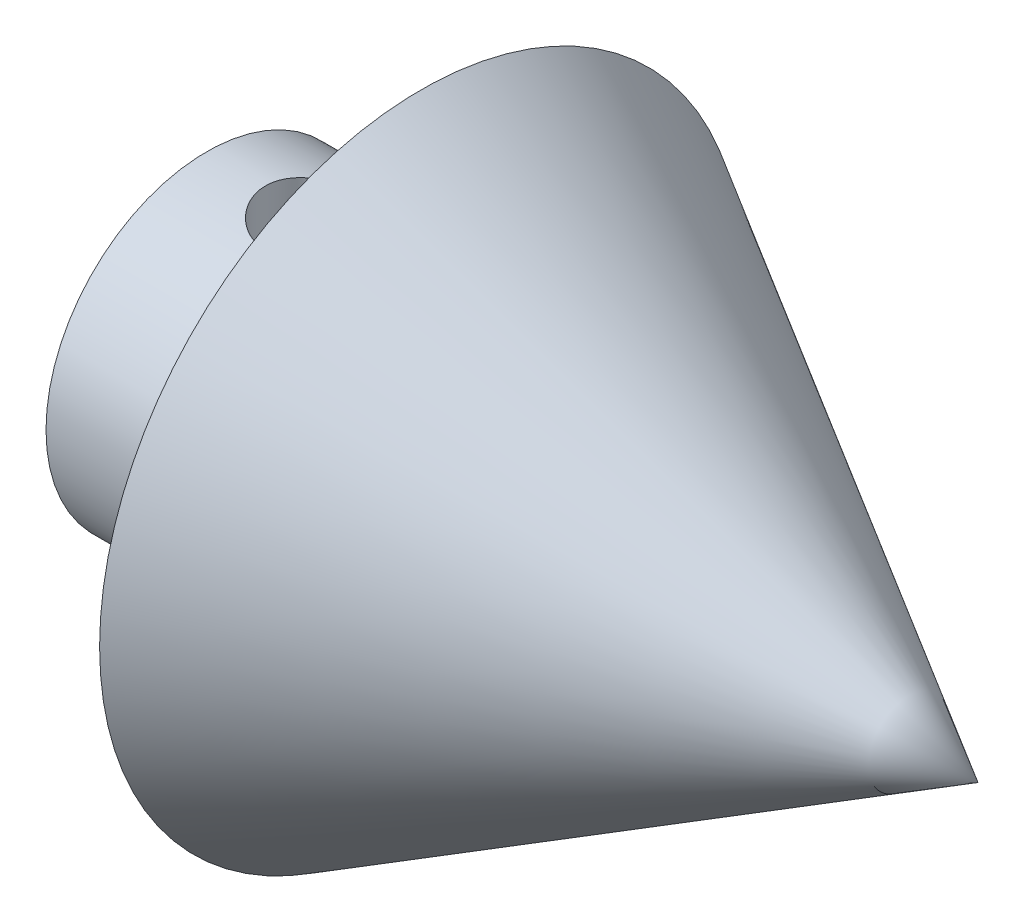
ISO-10303-21;
HEADER;
FILE_DESCRIPTION(('STEP AP214'),'2;1');
FILE_NAME('part.step','',(''),(''),'','','');
FILE_SCHEMA(('AUTOMOTIVE_DESIGN { 1 0 10303 214 1 1 1 1 }'));
ENDSEC;
DATA;
#1=APPLICATION_CONTEXT('core data for automotive mechanical design processes');
#2=APPLICATION_PROTOCOL_DEFINITION('international standard','automotive_design',2000,#1);
#3=PRODUCT_CONTEXT('',#1,'mechanical');
#4=PRODUCT('Part','Part','',(#3));
#5=PRODUCT_RELATED_PRODUCT_CATEGORY('part','',(#4));
#6=PRODUCT_DEFINITION_FORMATION('','',#4);
#7=PRODUCT_DEFINITION_CONTEXT('part definition',#1,'design');
#8=PRODUCT_DEFINITION('design','',#6,#7);
#9=PRODUCT_DEFINITION_SHAPE('','',#8);
#10=(LENGTH_UNIT() NAMED_UNIT(*) SI_UNIT(.MILLI.,.METRE.));
#11=(NAMED_UNIT(*) PLANE_ANGLE_UNIT() SI_UNIT($,.RADIAN.));
#12=(NAMED_UNIT(*) SI_UNIT($,.STERADIAN.) SOLID_ANGLE_UNIT());
#13=UNCERTAINTY_MEASURE_WITH_UNIT(LENGTH_MEASURE(1.E-05),#10,'distance_accuracy_value','');
#14=(GEOMETRIC_REPRESENTATION_CONTEXT(3) GLOBAL_UNCERTAINTY_ASSIGNED_CONTEXT((#13)) GLOBAL_UNIT_ASSIGNED_CONTEXT((#10,
#11,#12)) REPRESENTATION_CONTEXT('',''));
#15=CARTESIAN_POINT('',(0.,0.,0.));
#16=DIRECTION('',(0.,0.,1.));
#17=DIRECTION('',(1.,0.,0.));
#18=AXIS2_PLACEMENT_3D('',#15,#16,#17);
#19=CARTESIAN_POINT('',(10.,0.,0.));
#20=DIRECTION('',(-1.,0.,0.));
#21=DIRECTION('',(0.,0.,-1.));
#22=AXIS2_PLACEMENT_3D('',#19,#20,#21);
#23=CONICAL_SURFACE('',#22,15.,0.5235987755983);
#24=CARTESIAN_POINT('',(35.9807621135331,0.,0.));
#25=VERTEX_POINT('',#24);
#26=VERTEX_LOOP('',#25);
#27=FACE_BOUND('',#26,.T.);
#28=CARTESIAN_POINT('',(10.,0.,0.));
#29=DIRECTION('',(1.,0.,0.));
#30=DIRECTION('',(0.,0.,-1.));
#31=AXIS2_PLACEMENT_3D('',#28,#29,#30);
#32=CIRCLE('',#31,15.);
#33=CARTESIAN_POINT('',(10.,0.,-15.));
#34=VERTEX_POINT('',#33);
#35=EDGE_CURVE('E12',#34,#34,#32,.T.);
#36=ORIENTED_EDGE('',*,*,#35,.T.);
#37=EDGE_LOOP('',(#36));
#38=FACE_BOUND('',#37,.T.);
#39=ADVANCED_FACE('F41',(#27,#38),#23,.T.);
#40=CARTESIAN_POINT('',(10.,0.,0.));
#41=DIRECTION('',(1.,0.,0.));
#42=DIRECTION('',(0.,0.,-1.));
#43=AXIS2_PLACEMENT_3D('',#40,#41,#42);
#44=PLANE('',#43);
#45=CARTESIAN_POINT('',(10.,0.,0.));
#46=DIRECTION('',(1.,0.,0.));
#47=DIRECTION('',(0.,0.,-1.));
#48=AXIS2_PLACEMENT_3D('',#45,#46,#47);
#49=CIRCLE('',#48,4.05);
#50=CARTESIAN_POINT('',(10.,0.,-4.05));
#51=VERTEX_POINT('',#50);
#52=EDGE_CURVE('E44',#51,#51,#49,.T.);
#53=ORIENTED_EDGE('',*,*,#52,.T.);
#54=EDGE_LOOP('',(#53));
#55=FACE_BOUND('',#54,.T.);
#56=ORIENTED_EDGE('',*,*,#35,.F.);
#57=EDGE_LOOP('',(#56));
#58=FACE_BOUND('',#57,.T.);
#59=ADVANCED_FACE('F52',(#55,#58),#44,.F.);
#60=CARTESIAN_POINT('',(15.,0.,0.));
#61=DIRECTION('',(-1.,0.,0.));
#62=DIRECTION('',(0.,0.,1.));
#63=AXIS2_PLACEMENT_3D('',#60,#61,#62);
#64=CYLINDRICAL_SURFACE('',#63,4.05);
#65=CARTESIAN_POINT('',(15.,0.,0.));
#66=DIRECTION('',(-1.,0.,0.));
#67=DIRECTION('',(0.,0.,1.));
#68=AXIS2_PLACEMENT_3D('',#65,#66,#67);
#69=CIRCLE('',#68,4.05);
#70=CARTESIAN_POINT('',(15.,0.,4.05));
#71=VERTEX_POINT('',#70);
#72=EDGE_CURVE('E72',#71,#71,#69,.T.);
#73=ORIENTED_EDGE('',*,*,#72,.F.);
#74=EDGE_LOOP('',(#73));
#75=FACE_BOUND('',#74,.T.);
#76=ORIENTED_EDGE('',*,*,#52,.F.);
#77=EDGE_LOOP('',(#76));
#78=FACE_BOUND('',#77,.T.);
#79=ADVANCED_FACE('F56',(#75,#78),#64,.F.);
#80=CARTESIAN_POINT('',(15.,0.,0.));
#81=DIRECTION('',(-1.,0.,0.));
#82=DIRECTION('',(0.,0.,1.));
#83=AXIS2_PLACEMENT_3D('',#80,#81,#82);
#84=PLANE('',#83);
#85=ORIENTED_EDGE('',*,*,#72,.T.);
#86=EDGE_LOOP('',(#85));
#87=FACE_BOUND('',#86,.T.);
#88=ADVANCED_FACE('F61',(#87),#84,.T.);
#89=CLOSED_SHELL('',(#39,#59,#79,#88));
#90=MANIFOLD_SOLID_BREP('B2',#89);
#91=CARTESIAN_POINT('',(10.,0.,0.));
#92=DIRECTION('',(-1.,0.,0.));
#93=DIRECTION('',(0.,0.,1.));
#94=AXIS2_PLACEMENT_3D('',#91,#92,#93);
#95=CYLINDRICAL_SURFACE('',#94,7.5);
#96=CARTESIAN_POINT('',(4.99997596608746,7.15054229190611,2.26268533642265));
#97=CARTESIAN_POINT('',(4.87679337057992,7.15054357941597,2.26268379037705));
#98=CARTESIAN_POINT('',(4.75359544966686,7.15377912567736,2.25253215308062));
#99=CARTESIAN_POINT('',(4.51080102191502,7.16632195741708,2.21229762657343));
#100=CARTESIAN_POINT('',(4.39120573764294,7.17563128030004,2.18220804927137));
#101=CARTESIAN_POINT('',(4.15916661725308,7.19918001078882,2.10320912978589));
#102=CARTESIAN_POINT('',(4.0467112628587,7.21341122611226,2.05433104530812));
#103=CARTESIAN_POINT('',(3.83157418277967,7.24519755220514,1.93924281705836));
#104=CARTESIAN_POINT('',(3.72889391740794,7.26275315844224,1.87303008916539));
#105=CARTESIAN_POINT('',(3.53297816985963,7.29984344897836,1.72290983910972));
#106=CARTESIAN_POINT('',(3.44009708467844,7.3194203934373,1.63855014391216));
#107=CARTESIAN_POINT('',(3.26957251468485,7.35800717724413,1.45549573569578));
#108=CARTESIAN_POINT('',(3.19193098493638,7.3770169435645,1.35679918624189));
#109=CARTESIAN_POINT('',(3.0525510815369,7.4128192374948,1.14534984413225));
#110=CARTESIAN_POINT('',(2.99117397521269,7.42955791078668,1.03234900233786));
#111=CARTESIAN_POINT('',(2.88843702559571,7.45846843644308,0.797042016060031));
#112=CARTESIAN_POINT('',(2.84707287366626,7.47064127167081,0.674737881072196));
#113=CARTESIAN_POINT('',(2.78670860106753,7.48876981656921,0.428000959635591));
#114=CARTESIAN_POINT('',(2.76710357518289,7.49489313844391,0.303728694976725));
#115=CARTESIAN_POINT('',(2.74890143326738,7.50085211421138,0.0535167710069383));
#116=CARTESIAN_POINT('',(2.75029991273856,7.50068908635927,-0.0724225331864531));
#117=CARTESIAN_POINT('',(2.77365888009148,7.49422565060817,-0.318149834549734));
#118=CARTESIAN_POINT('',(2.79496431665145,7.48812050637206,-0.438006109529969));
#119=CARTESIAN_POINT('',(2.85646248674655,7.47072539564096,-0.672367378326634));
#120=CARTESIAN_POINT('',(2.89665641552489,7.45943510103633,-0.786872032994154));
#121=CARTESIAN_POINT('',(2.99523467955034,7.43269145067441,-1.00883638469506));
#122=CARTESIAN_POINT('',(3.05382519320071,7.41719119193473,-1.11619862729616));
#123=CARTESIAN_POINT('',(3.18737039533648,7.38368700026265,-1.31978264294365));
#124=CARTESIAN_POINT('',(3.26232896035293,7.36568247459895,-1.41600176863212));
#125=CARTESIAN_POINT('',(3.4298804391709,7.32829370867438,-1.59847613945729));
#126=CARTESIAN_POINT('',(3.52304092616726,7.30888303648189,-1.6842055085725));
#127=CARTESIAN_POINT('',(3.72260033447811,7.27148834343886,-1.83897067609428));
#128=CARTESIAN_POINT('',(3.82900056471838,7.25350446393415,-1.90800482196556));
#129=CARTESIAN_POINT('',(4.05340176115197,7.22089186084338,-2.02796414578094));
#130=CARTESIAN_POINT('',(4.17150386363441,7.20629683974785,-2.07870997891411));
#131=CARTESIAN_POINT('',(4.41511538994261,7.18252532669782,-2.15942601545848));
#132=CARTESIAN_POINT('',(4.54062238816178,7.17334707110536,-2.18940298153284));
#133=CARTESIAN_POINT('',(4.79047638508218,7.16184155109709,-2.22674551161446));
#134=CARTESIAN_POINT('',(4.91469278524462,7.15927207907318,-2.23491090818815));
#135=CARTESIAN_POINT('',(5.16272356848334,7.16060684068957,-2.23063135708042));
#136=CARTESIAN_POINT('',(5.28653800528867,7.16451017015378,-2.21818928802573));
#137=CARTESIAN_POINT('',(5.52691837024136,7.17811072703266,-2.1737609605993));
#138=CARTESIAN_POINT('',(5.6435889917182,7.18765518111397,-2.14228955606984));
#139=CARTESIAN_POINT('',(5.86998930147701,7.21129901931966,-2.06129438487067));
#140=CARTESIAN_POINT('',(5.97971791637162,7.22539910579693,-2.01176783444409));
#141=CARTESIAN_POINT('',(6.19237116029451,7.25702686699597,-1.89455265583966));
#142=CARTESIAN_POINT('',(6.29503464936533,7.27463626997283,-1.826412878353));
#143=CARTESIAN_POINT('',(6.48776833056485,7.31111006293411,-1.67444471772035));
#144=CARTESIAN_POINT('',(6.5778355051521,7.32997475203985,-1.59061258656261));
#145=CARTESIAN_POINT('',(6.74631470473028,7.36767887599484,-1.40588348120109));
#146=CARTESIAN_POINT('',(6.82416005669948,7.3864906044396,-1.3044627420674));
#147=CARTESIAN_POINT('',(6.96174688969916,7.42123382893236,-1.08955002088473));
#148=CARTESIAN_POINT('',(7.02148927104653,7.43716546820022,-0.976058639525608));
#149=CARTESIAN_POINT('',(7.12059797047447,7.46423645571167,-0.740980016307052));
#150=CARTESIAN_POINT('',(7.16011655699601,7.47541150640662,-0.619461292916118));
#151=CARTESIAN_POINT('',(7.21804609458142,7.49184466416593,-0.371115680143111));
#152=CARTESIAN_POINT('',(7.23646307248382,7.49710446068038,-0.244290317124202));
#153=CARTESIAN_POINT('',(7.25120896576398,7.50100074956921,0.00582989937588605));
#154=CARTESIAN_POINT('',(7.24835975550943,7.49988407655861,0.129073057368888));
#155=CARTESIAN_POINT('',(7.22261839563886,7.49170308639229,0.373235947269854));
#156=CARTESIAN_POINT('',(7.19972737880506,7.48463910538503,0.49415581009796));
#157=CARTESIAN_POINT('',(7.13506045683857,7.46540896299629,0.728981152795254));
#158=CARTESIAN_POINT('',(7.09348925827731,7.453298208438,0.842947846439346));
#159=CARTESIAN_POINT('',(6.99282511961403,7.42520569547836,1.06233995024026));
#160=CARTESIAN_POINT('',(6.9337293031484,7.40922330169316,1.16776395464252));
#161=CARTESIAN_POINT('',(6.79750393320205,7.37441629557474,1.37074177700638));
#162=CARTESIAN_POINT('',(6.71985847627231,7.35551718275013,1.46793647347106));
#163=CARTESIAN_POINT('',(6.54966740551019,7.3172383626256,1.64819008295867));
#164=CARTESIAN_POINT('',(6.45711750370667,7.29785851838191,1.73124491378951));
#165=CARTESIAN_POINT('',(6.25644220196665,7.26012045374531,1.88334417729523));
#166=CARTESIAN_POINT('',(6.14793552080273,7.24180974073265,1.95189862573339));
#167=CARTESIAN_POINT('',(5.92040510521046,7.20902352037099,2.06972021261822));
#168=CARTESIAN_POINT('',(5.80138647548075,7.19454616501566,2.11899665020652));
#169=CARTESIAN_POINT('',(5.56950200313366,7.1724926512954,2.19240854752189));
#170=CARTESIAN_POINT('',(5.45736728477538,7.16433860623185,2.2186899329654));
#171=CARTESIAN_POINT('',(5.23015109751146,7.15336335711365,2.25382731112916));
#172=CARTESIAN_POINT('',(5.11507022125192,7.15054108893594,2.26268678095275));
#173=CARTESIAN_POINT('',(4.99997596608746,7.15054229190611,2.26268533642265));
#174=B_SPLINE_CURVE_WITH_KNOTS('',3,(#96,#97,#98,#99,#100,#101,#102,#103,#104,#105,#106,#107,
#108,#109,#110,#111,#112,#113,#114,#115,#116,#117,#118,#119,#120,#121,#122,#123,#124,#125,#126,
#127,#128,#129,#130,#131,#132,#133,#134,#135,#136,#137,#138,#139,#140,#141,#142,#143,#144,#145,
#146,#147,#148,#149,#150,#151,#152,#153,#154,#155,#156,#157,#158,#159,#160,#161,#162,#163,#164,
#165,#166,#167,#168,#169,#170,#171,#172,#173),.UNSPECIFIED.,.T.,.F.,(4,2,2,2,2,2,2,2,2,2,2,2,2,
2,2,2,2,2,2,2,2,2,2,2,2,2,2,2,2,2,2,2,2,2,2,2,2,2,4),(0.,0.369123231396214,0.738370346227436,
1.10700579931818,1.47569623718931,1.85493814886536,2.23422868126905,2.62134678070632,
3.00838149943743,3.38436389732316,3.7602674516756,4.12422154598411,4.48819867401306,
4.85641013182744,5.22470888984949,5.60717964069045,5.98968823397006,6.37585191227168,
6.76188979055798,7.13356380691976,7.50518590906033,7.86717723590781,8.22922439848928,
8.60097390147329,8.97281230784723,9.35865414884421,9.7444767975788,10.1273501267049,
10.5101140759526,10.8781641570206,11.2461934368859,11.6102844715312,11.9744352985438,
12.3502220396453,12.7261170874208,13.1131883913157,13.5000727525803,13.8450276936651,
14.1899137809115),.UNSPECIFIED.);
#175=CARTESIAN_POINT('',(4.99997596608746,7.15054229190611,2.26268533642265));
#176=VERTEX_POINT('',#175);
#177=EDGE_CURVE('E117',#176,#176,#174,.T.);
#178=ORIENTED_EDGE('',*,*,#177,.T.);
#179=EDGE_LOOP('',(#178));
#180=FACE_BOUND('',#179,.T.);
#181=CARTESIAN_POINT('',(10.,0.,0.));
#182=DIRECTION('',(1.,0.,0.));
#183=DIRECTION('',(0.,0.,-1.));
#184=AXIS2_PLACEMENT_3D('',#181,#182,#183);
#185=CIRCLE('',#184,7.5);
#186=CARTESIAN_POINT('',(10.,0.,-7.5));
#187=VERTEX_POINT('',#186);
#188=EDGE_CURVE('E40',#187,#187,#185,.T.);
#189=ORIENTED_EDGE('',*,*,#188,.F.);
#190=EDGE_LOOP('',(#189));
#191=FACE_BOUND('',#190,.T.);
#192=CARTESIAN_POINT('',(0.,0.,0.));
#193=DIRECTION('',(1.,0.,0.));
#194=DIRECTION('',(0.,0.,-1.));
#195=AXIS2_PLACEMENT_3D('',#192,#193,#194);
#196=CIRCLE('',#195,7.5);
#197=CARTESIAN_POINT('',(0.,0.,-7.5));
#198=VERTEX_POINT('',#197);
#199=EDGE_CURVE('E103',#198,#198,#196,.T.);
#200=ORIENTED_EDGE('',*,*,#199,.T.);
#201=EDGE_LOOP('',(#200));
#202=FACE_BOUND('',#201,.T.);
#203=ADVANCED_FACE('F99',(#180,#191,#202),#95,.T.);
#204=CARTESIAN_POINT('',(10.,0.,0.));
#205=DIRECTION('',(1.,0.,0.));
#206=DIRECTION('',(0.,0.,-1.));
#207=AXIS2_PLACEMENT_3D('',#204,#205,#206);
#208=PLANE('',#207);
#209=CARTESIAN_POINT('',(10.,0.,0.));
#210=DIRECTION('',(1.,0.,0.));
#211=DIRECTION('',(0.,0.,-1.));
#212=AXIS2_PLACEMENT_3D('',#209,#210,#211);
#213=CIRCLE('',#212,4.05);
#214=CARTESIAN_POINT('',(10.,0.,-4.05));
#215=VERTEX_POINT('',#214);
#216=EDGE_CURVE('E110',#215,#215,#213,.T.);
#217=ORIENTED_EDGE('',*,*,#216,.F.);
#218=EDGE_LOOP('',(#217));
#219=FACE_BOUND('',#218,.T.);
#220=ORIENTED_EDGE('',*,*,#188,.T.);
#221=EDGE_LOOP('',(#220));
#222=FACE_BOUND('',#221,.T.);
#223=ADVANCED_FACE('F139',(#219,#222),#208,.T.);
#224=CARTESIAN_POINT('',(0.,0.,0.));
#225=DIRECTION('',(1.,0.,0.));
#226=DIRECTION('',(0.,0.,-1.));
#227=AXIS2_PLACEMENT_3D('',#224,#225,#226);
#228=PLANE('',#227);
#229=CARTESIAN_POINT('',(0.,0.,0.));
#230=DIRECTION('',(-1.,0.,0.));
#231=DIRECTION('',(0.,0.,1.));
#232=AXIS2_PLACEMENT_3D('',#229,#230,#231);
#233=CIRCLE('',#232,4.05);
#234=CARTESIAN_POINT('',(0.,0.,4.05));
#235=VERTEX_POINT('',#234);
#236=EDGE_CURVE('E114',#235,#235,#233,.T.);
#237=ORIENTED_EDGE('',*,*,#236,.F.);
#238=EDGE_LOOP('',(#237));
#239=FACE_BOUND('',#238,.T.);
#240=ORIENTED_EDGE('',*,*,#199,.F.);
#241=EDGE_LOOP('',(#240));
#242=FACE_BOUND('',#241,.T.);
#243=ADVANCED_FACE('F137',(#239,#242),#228,.F.);
#244=CARTESIAN_POINT('',(15.,0.,0.));
#245=DIRECTION('',(-1.,0.,0.));
#246=DIRECTION('',(0.,0.,1.));
#247=AXIS2_PLACEMENT_3D('',#244,#245,#246);
#248=CYLINDRICAL_SURFACE('',#247,4.05);
#249=CARTESIAN_POINT('',(4.99997596608746,3.36424011223727,2.2548588574928));
#250=CARTESIAN_POINT('',(5.11497084211201,3.36425389212509,2.25484869559021));
#251=CARTESIAN_POINT('',(5.23006670093449,3.37024068058095,2.245984675332));
#252=CARTESIAN_POINT('',(5.45654963482114,3.39324792214886,2.21105714786235));
#253=CARTESIAN_POINT('',(5.56793028003154,3.41028655645953,2.18496529817784));
#254=CARTESIAN_POINT('',(5.78325279183354,3.45277892656039,2.11716585432869));
#255=CARTESIAN_POINT('',(5.88723694271725,3.47817919862475,2.07555725427743));
#256=CARTESIAN_POINT('',(6.08669774873632,3.53445285557669,1.97820540144739));
#257=CARTESIAN_POINT('',(6.18217251846732,3.5653274488896,1.92245902666348));
#258=CARTESIAN_POINT('',(6.3727320989549,3.63294480437054,1.79169321094266));
#259=CARTESIAN_POINT('',(6.46676221536023,3.66996439903257,1.71527942247952));
#260=CARTESIAN_POINT('',(6.64150870124206,3.74350976909221,1.54821575527799));
#261=CARTESIAN_POINT('',(6.72221693448122,3.78003523029324,1.45755724216667));
#262=CARTESIAN_POINT('',(6.87501710984717,3.852318338207,1.2548693668922));
#263=CARTESIAN_POINT('',(6.94572782096121,3.88772619692113,1.14166190664754));
#264=CARTESIAN_POINT('',(7.06659596931252,3.95006149994491,0.90261891777954));
#265=CARTESIAN_POINT('',(7.11676935589879,3.97699552128659,0.776793283382065));
#266=CARTESIAN_POINT('',(7.19067280273627,4.01734072668173,0.527319994504828));
#267=CARTESIAN_POINT('',(7.21627733717308,4.03170140770514,0.404384884013285));
#268=CARTESIAN_POINT('',(7.24657653453463,4.04894584849844,0.155204239708181));
#269=CARTESIAN_POINT('',(7.25128740822192,4.05183850577781,0.0289613488319389));
#270=CARTESIAN_POINT('',(7.24018479358811,4.04617566324327,-0.208785918260737));
#271=CARTESIAN_POINT('',(7.22650536663994,4.03880749778107,-0.320427040653848));
#272=CARTESIAN_POINT('',(7.18295399750104,4.01541167770484,-0.539545908995961));
#273=CARTESIAN_POINT('',(7.15308080757424,3.99938335582254,-0.647023333446526));
#274=CARTESIAN_POINT('',(7.07801513363696,3.95989349912195,-0.856277512983315));
#275=CARTESIAN_POINT('',(7.03266723097642,3.93635671660513,-0.957983718360281));
#276=CARTESIAN_POINT('',(6.92827000033837,3.88385180665874,-1.15254670368684));
#277=CARTESIAN_POINT('',(6.86921636101909,3.85488197073357,-1.24540068604576));
#278=CARTESIAN_POINT('',(6.7317550861205,3.79036987643772,-1.43045921507305));
#279=CARTESIAN_POINT('',(6.65193875089875,3.75445538601598,-1.52148741696997));
#280=CARTESIAN_POINT('',(6.47889440787034,3.68188158961902,-1.68957042041211));
#281=CARTESIAN_POINT('',(6.38565225709279,3.64522153367085,-1.76661029045801));
#282=CARTESIAN_POINT('',(6.17829210733914,3.57154130084337,-1.91148465453799));
#283=CARTESIAN_POINT('',(6.06304871524711,3.53478848307242,-1.97785621141311));
#284=CARTESIAN_POINT('',(5.82056870945581,3.46977478513629,-2.08983272798336));
#285=CARTESIAN_POINT('',(5.6933461979811,3.44150407976974,-2.13546174648875));
#286=CARTESIAN_POINT('',(5.50173829353656,3.41005258843711,-2.18503306730166));
#287=CARTESIAN_POINT('',(5.44048640028464,3.40156461212721,-2.19818408187653));
#288=CARTESIAN_POINT('',(5.31676061161962,3.38779339488815,-2.21935118702792));
#289=CARTESIAN_POINT('',(5.25428745709044,3.38250826962292,-2.2273702970181));
#290=CARTESIAN_POINT('',(5.12873779295727,3.37540511794709,-2.23812034172942));
#291=CARTESIAN_POINT('',(5.06566178308493,3.37358443436167,-2.24085532931795));
#292=CARTESIAN_POINT('',(4.93952141452079,3.37348386937882,-2.24100469869978));
#293=CARTESIAN_POINT('',(4.8764570553212,3.3752035834607,-2.23841968834831));
#294=CARTESIAN_POINT('',(4.70701232902387,3.38454427870411,-2.2242983656997));
#295=CARTESIAN_POINT('',(4.60117874098137,3.39545087689594,-2.20776678069978));
#296=CARTESIAN_POINT('',(4.39416338966706,3.42586266005475,-2.160262707839));
#297=CARTESIAN_POINT('',(4.29298376681002,3.4453717586015,-2.12928364694343));
#298=CARTESIAN_POINT('',(4.09315999069943,3.49164501022254,-2.05255816121551));
#299=CARTESIAN_POINT('',(3.99479352418095,3.51867572293926,-2.00625424714805));
#300=CARTESIAN_POINT('',(3.80663288835036,3.57681929570613,-1.90065635325679));
#301=CARTESIAN_POINT('',(3.71684293988754,3.607934148024,-1.84135602418805));
#302=CARTESIAN_POINT('',(3.53313060644629,3.67676427253866,-1.70029667982063));
#303=CARTESIAN_POINT('',(3.44089364833019,3.7147324528652,-1.61645583906648));
#304=CARTESIAN_POINT('',(3.27109634341315,3.78882071733586,-1.43423094403103));
#305=CARTESIAN_POINT('',(3.19354502231182,3.82493965506289,-1.33583801185242));
#306=CARTESIAN_POINT('',(3.05144951976347,3.89361509042534,-1.12057100750824));
#307=CARTESIAN_POINT('',(2.98782316150646,3.92587762656213,-1.00298983074137));
#308=CARTESIAN_POINT('',(2.88191946703885,3.98071309947987,-0.756505328532974));
#309=CARTESIAN_POINT('',(2.83961962912116,4.00329624524109,-0.627614105721027));
#310=CARTESIAN_POINT('',(2.78189434722203,4.03424853545822,-0.376406942990132));
#311=CARTESIAN_POINT('',(2.76415612736117,4.04383870046387,-0.254773998192213));
#312=CARTESIAN_POINT('',(2.74881164942269,4.05183589225772,-0.00990112930559649));
#313=CARTESIAN_POINT('',(2.75119434369833,4.05024905600166,0.113337875843924));
#314=CARTESIAN_POINT('',(2.77477206045018,4.03673133749707,0.345864689390658));
#315=CARTESIAN_POINT('',(2.79421790449852,4.02576458656794,0.455393692815875));
#316=CARTESIAN_POINT('',(2.84864617779585,3.99576695435253,0.669342604928596));
#317=CARTESIAN_POINT('',(2.88363042862773,3.97673512760142,0.77376191300763));
#318=CARTESIAN_POINT('',(2.96917804457488,3.93145978046241,0.978512466795942));
#319=CARTESIAN_POINT('',(3.02021716616841,3.90499911493613,1.07859530595267));
#320=CARTESIAN_POINT('',(3.13582616434749,3.84731723882177,1.26908251833162));
#321=CARTESIAN_POINT('',(3.2004013868523,3.81609414870257,1.35948304626515));
#322=CARTESIAN_POINT('',(3.34985752398818,3.74748182629774,1.53921131962632));
#323=CARTESIAN_POINT('',(3.4362265011824,3.70979777204212,1.62719184261585));
#324=CARTESIAN_POINT('',(3.62236920919528,3.63498526691046,1.7880917685727));
#325=CARTESIAN_POINT('',(3.72215946727433,3.59785756480402,1.86099231626013));
#326=CARTESIAN_POINT('',(3.94112775849769,3.52564948944287,1.99461079149017));
#327=CARTESIAN_POINT('',(4.06117550267469,3.49089642727201,2.05411232258233));
#328=CARTESIAN_POINT('',(4.24912252055707,3.44662694577442,2.12698577594081));
#329=CARTESIAN_POINT('',(4.3130295374398,3.43318812840498,2.14853635262972));
#330=CARTESIAN_POINT('',(4.44305471099241,3.40950831770441,2.18591924753864));
#331=CARTESIAN_POINT('',(4.50917144695148,3.39926531184672,2.20175516548932));
#332=CARTESIAN_POINT('',(4.64556062223441,3.38218733137986,2.22790630226906));
#333=CARTESIAN_POINT('',(4.71589576628207,3.37549536877365,2.23799092998235));
#334=CARTESIAN_POINT('',(4.85746636111181,3.36651759816385,2.2514701907228));
#335=CARTESIAN_POINT('',(4.92870176702167,3.36423157141788,2.25486515587315));
#336=CARTESIAN_POINT('',(4.99997596608746,3.36424011223727,2.2548588574928));
#337=B_SPLINE_CURVE_WITH_KNOTS('',3,(#249,#250,#251,#252,#253,#254,#255,#256,#257,#258,#259,
#260,#261,#262,#263,#264,#265,#266,#267,#268,#269,#270,#271,#272,#273,#274,#275,#276,#277,#278,
#279,#280,#281,#282,#283,#284,#285,#286,#287,#288,#289,#290,#291,#292,#293,#294,#295,#296,#297,
#298,#299,#300,#301,#302,#303,#304,#305,#306,#307,#308,#309,#310,#311,#312,#313,#314,#315,#316,
#317,#318,#319,#320,#321,#322,#323,#324,#325,#326,#327,#328,#329,#330,#331,#332,#333,#334,#335,
#336),.UNSPECIFIED.,.T.,.F.,(4,2,2,2,2,2,2,2,2,2,2,2,2,2,2,2,2,2,2,2,2,2,2,2,2,2,2,2,2,2,2,2,2,
2,2,2,2,2,2,2,2,2,2,4),(0.,0.344691070656033,0.689950629676463,1.03304416282034,
1.37621352641799,1.75475732675601,2.13353147115424,2.54560441568156,2.95735673315154,
3.33435576820091,3.71106224981882,4.04761767411684,4.3841990338345,4.72426547701266,
5.06443903844506,5.44172989554669,5.81942114478192,6.23127509174898,6.64265011192268,
6.83206228608385,7.02136291475874,7.21051829407466,7.39965206197158,7.72103822254555,
8.04257074407076,8.3773940894747,8.71238137494574,9.10161558055871,9.49108823612403,
9.90139712941873,10.3112721932003,10.679077329113,11.0466805300202,11.3804971363273,
11.7143528866203,12.0592194252837,12.4042224222966,12.7893450263807,13.1749462968657,
13.5876497874206,13.7936704015715,13.9995610134504,14.2132122702629,14.4268529196157),.UNSPECIFIED.);
#338=CARTESIAN_POINT('',(4.99997596608746,3.36424011223727,2.2548588574928));
#339=VERTEX_POINT('',#338);
#340=EDGE_CURVE('E123',#339,#339,#337,.T.);
#341=ORIENTED_EDGE('',*,*,#340,.T.);
#342=EDGE_LOOP('',(#341));
#343=FACE_BOUND('',#342,.T.);
#344=ORIENTED_EDGE('',*,*,#216,.T.);
#345=EDGE_LOOP('',(#344));
#346=FACE_BOUND('',#345,.T.);
#347=ORIENTED_EDGE('',*,*,#236,.T.);
#348=EDGE_LOOP('',(#347));
#349=FACE_BOUND('',#348,.T.);
#350=ADVANCED_FACE('F130',(#343,#346,#349),#248,.F.);
#351=CARTESIAN_POINT('',(4.99997596608746,7.49998397743015,0.0155028478415564));
#352=DIRECTION('',(0.,0.999997863657352,0.00206704637887413));
#353=DIRECTION('',(0.,-0.00206704637887413,0.999997863657352));
#354=AXIS2_PLACEMENT_3D('',#351,#352,#353);
#355=CYLINDRICAL_SURFACE('',#354,2.24789999999999);
#356=ORIENTED_EDGE('',*,*,#340,.F.);
#357=EDGE_LOOP('',(#356));
#358=FACE_BOUND('',#357,.T.);
#359=ORIENTED_EDGE('',*,*,#177,.F.);
#360=EDGE_LOOP('',(#359));
#361=FACE_BOUND('',#360,.T.);
#362=ADVANCED_FACE('F127',(#358,#361),#355,.F.);
#363=CLOSED_SHELL('',(#203,#223,#243,#350,#362));
#364=MANIFOLD_SOLID_BREP('B6',#363);
#365=ADVANCED_BREP_SHAPE_REPRESENTATION('',(#18,#90,#364),#14);
#366=SHAPE_DEFINITION_REPRESENTATION(#9,#365);
ENDSEC;
END-ISO-10303-21;
